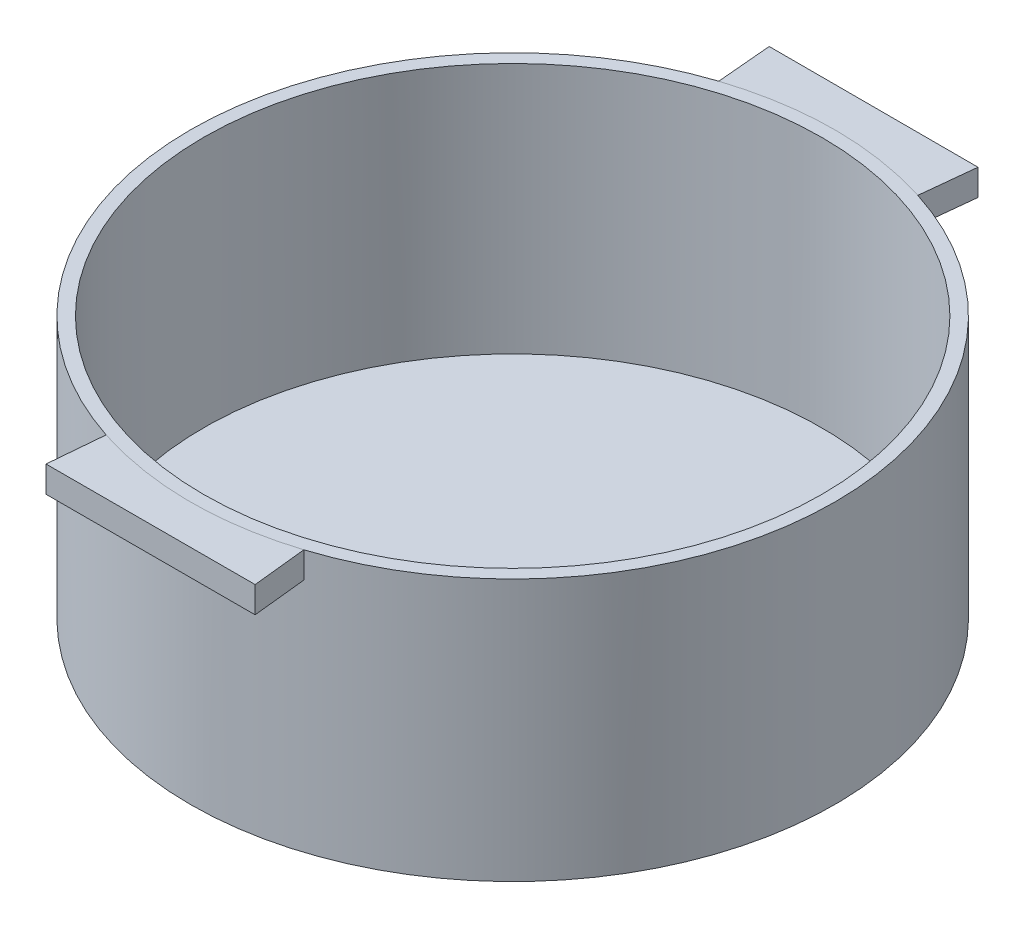
ISO-10303-21;
HEADER;
FILE_DESCRIPTION(('STEP AP214'),'2;1');
FILE_NAME('part.step','',(''),(''),'','','');
FILE_SCHEMA(('AUTOMOTIVE_DESIGN { 1 0 10303 214 1 1 1 1 }'));
ENDSEC;
DATA;
#1=APPLICATION_CONTEXT('core data for automotive mechanical design processes');
#2=APPLICATION_PROTOCOL_DEFINITION('international standard','automotive_design',2000,#1);
#3=PRODUCT_CONTEXT('',#1,'mechanical');
#4=PRODUCT('Part','Part','',(#3));
#5=PRODUCT_RELATED_PRODUCT_CATEGORY('part','',(#4));
#6=PRODUCT_DEFINITION_FORMATION('','',#4);
#7=PRODUCT_DEFINITION_CONTEXT('part definition',#1,'design');
#8=PRODUCT_DEFINITION('design','',#6,#7);
#9=PRODUCT_DEFINITION_SHAPE('','',#8);
#10=(LENGTH_UNIT() NAMED_UNIT(*) SI_UNIT(.MILLI.,.METRE.));
#11=(NAMED_UNIT(*) PLANE_ANGLE_UNIT() SI_UNIT($,.RADIAN.));
#12=(NAMED_UNIT(*) SI_UNIT($,.STERADIAN.) SOLID_ANGLE_UNIT());
#13=UNCERTAINTY_MEASURE_WITH_UNIT(LENGTH_MEASURE(1.E-05),#10,'distance_accuracy_value','');
#14=(GEOMETRIC_REPRESENTATION_CONTEXT(3) GLOBAL_UNCERTAINTY_ASSIGNED_CONTEXT((#13)) GLOBAL_UNIT_ASSIGNED_CONTEXT((#10,
#11,#12)) REPRESENTATION_CONTEXT('',''));
#15=CARTESIAN_POINT('',(0.,0.,0.));
#16=DIRECTION('',(0.,0.,1.));
#17=DIRECTION('',(1.,0.,0.));
#18=AXIS2_PLACEMENT_3D('',#15,#16,#17);
#19=CARTESIAN_POINT('',(0.00483893654175435,-6.7795140591854,0.792868471180382));
#20=DIRECTION('',(0.,1.,0.));
#21=DIRECTION('',(0.,0.,1.));
#22=AXIS2_PLACEMENT_3D('',#19,#20,#21);
#23=CYLINDRICAL_SURFACE('',#22,88.5);
#24=CARTESIAN_POINT('',(0.00483893654175435,65.2204859408146,0.792868471180382));
#25=DIRECTION('',(0.,1.,0.));
#26=DIRECTION('',(0.,0.,1.));
#27=AXIS2_PLACEMENT_3D('',#24,#25,#26);
#28=CIRCLE('',#27,88.5);
#29=CARTESIAN_POINT('',(0.00483893654175435,65.2204859408146,89.2928684711804));
#30=VERTEX_POINT('',#29);
#31=EDGE_CURVE('E290',#30,#30,#28,.T.);
#32=ORIENTED_EDGE('',*,*,#31,.T.);
#33=EDGE_LOOP('',(#32));
#34=FACE_BOUND('',#33,.T.);
#35=DIRECTION('',(0.,-1.,0.));
#36=VECTOR('',#35,1.);
#37=CARTESIAN_POINT('',(13.7811867698871,-7.5295140591854,88.2140457703605));
#38=LINE('',#37,#36);
#39=CARTESIAN_POINT('',(13.7811867698871,-5.2795140591854,88.2140457703605));
#40=VERTEX_POINT('',#39);
#41=CARTESIAN_POINT('',(13.7811867698871,-6.7795140591854,88.2140457703605));
#42=VERTEX_POINT('',#41);
#43=EDGE_CURVE('E391',#40,#42,#38,.T.);
#44=ORIENTED_EDGE('',*,*,#43,.F.);
#45=CARTESIAN_POINT('',(0.00483893654175435,-5.2795140591854,0.792868471180382));
#46=DIRECTION('',(0.,1.,0.));
#47=DIRECTION('',(0.,0.,1.));
#48=AXIS2_PLACEMENT_3D('',#45,#46,#47);
#49=CIRCLE('',#48,88.5);
#50=CARTESIAN_POINT('',(-13.7715088968036,-5.2795140591854,88.2140457703605));
#51=VERTEX_POINT('',#50);
#52=EDGE_CURVE('E298',#40,#51,#49,.F.);
#53=ORIENTED_EDGE('',*,*,#52,.T.);
#54=DIRECTION('',(0.,-1.,0.));
#55=VECTOR('',#54,1.);
#56=CARTESIAN_POINT('',(-13.7715088968036,-7.5295140591854,88.2140457703605));
#57=LINE('',#56,#55);
#58=CARTESIAN_POINT('',(-13.7715088968036,-6.7795140591854,88.2140457703605));
#59=VERTEX_POINT('',#58);
#60=EDGE_CURVE('E386',#59,#51,#57,.F.);
#61=ORIENTED_EDGE('',*,*,#60,.F.);
#62=CARTESIAN_POINT('',(0.00483893654175435,-6.7795140591854,0.792868471180382));
#63=DIRECTION('',(0.,1.,0.));
#64=DIRECTION('',(0.,0.,1.));
#65=AXIS2_PLACEMENT_3D('',#62,#63,#64);
#66=CIRCLE('',#65,88.5);
#67=EDGE_CURVE('E282',#42,#59,#66,.T.);
#68=ORIENTED_EDGE('',*,*,#67,.F.);
#69=EDGE_LOOP('',(#44,#53,#61,#68));
#70=FACE_BOUND('',#69,.T.);
#71=ADVANCED_FACE('F42',(#34,#70),#23,.F.);
#72=CARTESIAN_POINT('',(0.00483893654175435,65.2204859408146,0.792868471180382));
#73=DIRECTION('',(0.,-1.,0.));
#74=DIRECTION('',(0.,0.,-1.));
#75=AXIS2_PLACEMENT_3D('',#72,#73,#74);
#76=CYLINDRICAL_SURFACE('',#75,92.25);
#77=CARTESIAN_POINT('',(0.00483893654175435,57.7204859408146,0.792868471180382));
#78=DIRECTION('',(0.,1.,0.));
#79=DIRECTION('',(0.,0.,1.));
#80=AXIS2_PLACEMENT_3D('',#77,#78,#79);
#81=CIRCLE('',#80,92.25);
#82=CARTESIAN_POINT('',(28.1015082692353,57.7204859408146,-87.0743021468));
#83=VERTEX_POINT('',#82);
#84=CARTESIAN_POINT('',(-28.6746527071315,57.7204859408146,-86.885802019769));
#85=VERTEX_POINT('',#84);
#86=EDGE_CURVE('E11',#83,#85,#81,.T.);
#87=ORIENTED_EDGE('',*,*,#86,.F.);
#88=DIRECTION('',(0.,1.,0.));
#89=VECTOR('',#88,1.);
#90=CARTESIAN_POINT('',(28.1015082692353,57.7204859408146,-87.0743021468));
#91=LINE('',#90,#89);
#92=CARTESIAN_POINT('',(28.1015082692353,65.2204859408146,-87.0743021468));
#93=VERTEX_POINT('',#92);
#94=EDGE_CURVE('E331',#83,#93,#91,.T.);
#95=ORIENTED_EDGE('',*,*,#94,.T.);
#96=CARTESIAN_POINT('',(0.00483893654175435,65.2204859408146,0.792868471180382));
#97=DIRECTION('',(0.,1.,0.));
#98=DIRECTION('',(0.,0.,1.));
#99=AXIS2_PLACEMENT_3D('',#96,#97,#98);
#100=CIRCLE('',#99,92.25);
#101=CARTESIAN_POINT('',(28.1015082692353,65.2204859408146,88.6600390891608));
#102=VERTEX_POINT('',#101);
#103=EDGE_CURVE('E287',#102,#93,#100,.T.);
#104=ORIENTED_EDGE('',*,*,#103,.F.);
#105=DIRECTION('',(0.,1.,0.));
#106=VECTOR('',#105,1.);
#107=CARTESIAN_POINT('',(28.1015082692353,57.7204859408146,88.6600390891608));
#108=LINE('',#107,#106);
#109=CARTESIAN_POINT('',(28.1015082692353,57.7204859408146,88.6600390891608));
#110=VERTEX_POINT('',#109);
#111=EDGE_CURVE('E380',#110,#102,#108,.T.);
#112=ORIENTED_EDGE('',*,*,#111,.F.);
#113=CARTESIAN_POINT('',(0.00483893654175435,57.7204859408146,0.792868471180382));
#114=DIRECTION('',(0.,-1.,0.));
#115=DIRECTION('',(0.,0.,-1.));
#116=AXIS2_PLACEMENT_3D('',#113,#114,#115);
#117=CIRCLE('',#116,92.25);
#118=CARTESIAN_POINT('',(-28.6746527071315,57.7204859408146,88.4715389621298));
#119=VERTEX_POINT('',#118);
#120=EDGE_CURVE('E308',#110,#119,#117,.T.);
#121=ORIENTED_EDGE('',*,*,#120,.T.);
#122=DIRECTION('',(0.,1.,0.));
#123=VECTOR('',#122,1.);
#124=CARTESIAN_POINT('',(-28.6746527071315,57.7204859408146,88.4715389621298));
#125=LINE('',#124,#123);
#126=CARTESIAN_POINT('',(-28.6746527071315,65.2204859408146,88.4715389621298));
#127=VERTEX_POINT('',#126);
#128=EDGE_CURVE('E216',#119,#127,#125,.T.);
#129=ORIENTED_EDGE('',*,*,#128,.T.);
#130=CARTESIAN_POINT('',(-28.6746527071315,65.2204859408146,-86.885802019769));
#131=VERTEX_POINT('',#130);
#132=EDGE_CURVE('E281',#131,#127,#100,.T.);
#133=ORIENTED_EDGE('',*,*,#132,.F.);
#134=DIRECTION('',(0.,1.,0.));
#135=VECTOR('',#134,1.);
#136=CARTESIAN_POINT('',(-28.6746527071315,57.7204859408146,-86.885802019769));
#137=LINE('',#136,#135);
#138=EDGE_CURVE('E61',#85,#131,#137,.T.);
#139=ORIENTED_EDGE('',*,*,#138,.F.);
#140=EDGE_LOOP('',(#87,#95,#104,#112,#121,#129,#133,#139));
#141=FACE_BOUND('',#140,.T.);
#142=CARTESIAN_POINT('',(0.00483893654175435,-9.7795140591854,0.792868471180382));
#143=DIRECTION('',(0.,1.,0.));
#144=DIRECTION('',(0.,0.,1.));
#145=AXIS2_PLACEMENT_3D('',#142,#143,#144);
#146=CIRCLE('',#145,92.25);
#147=CARTESIAN_POINT('',(0.00483893654175435,-9.7795140591854,93.0428684711804));
#148=VERTEX_POINT('',#147);
#149=EDGE_CURVE('E278',#148,#148,#146,.T.);
#150=ORIENTED_EDGE('',*,*,#149,.T.);
#151=EDGE_LOOP('',(#150));
#152=FACE_BOUND('',#151,.T.);
#153=ADVANCED_FACE('F44',(#141,#152),#76,.T.);
#154=CARTESIAN_POINT('',(0.00483893654175435,65.2204859408146,0.792868471180382));
#155=DIRECTION('',(0.,1.,0.));
#156=DIRECTION('',(0.,0.,1.));
#157=AXIS2_PLACEMENT_3D('',#154,#155,#156);
#158=PLANE('',#157);
#159=CARTESIAN_POINT('',(-28.6746527071315,65.2204859408146,-86.885802019769));
#160=CARTESIAN_POINT('',(-0.301330472783207,65.2204859408146,-95.9332188019076));
#161=CARTESIAN_POINT('',(28.1015082692353,65.2204859408146,-87.0743021468));
#162=B_SPLINE_CURVE_WITH_KNOTS('',2,(#159,#160,#161),.UNSPECIFIED.,.F.,.F.,(3,3),(0.,1.),.UNSPECIFIED.);
#163=EDGE_CURVE('E51',#131,#93,#162,.T.);
#164=ORIENTED_EDGE('',*,*,#163,.F.);
#165=ORIENTED_EDGE('',*,*,#132,.T.);
#166=CARTESIAN_POINT('',(28.1015082692353,65.2204859408146,88.6600390891608));
#167=CARTESIAN_POINT('',(-0.301330472783207,65.2204859408146,97.5189557442683));
#168=CARTESIAN_POINT('',(-28.6746527071315,65.2204859408146,88.4715389621298));
#169=B_SPLINE_CURVE_WITH_KNOTS('',2,(#166,#167,#168),.UNSPECIFIED.,.F.,.F.,(3,3),(0.,1.),.UNSPECIFIED.);
#170=EDGE_CURVE('E302',#102,#127,#169,.T.);
#171=ORIENTED_EDGE('',*,*,#170,.F.);
#172=ORIENTED_EDGE('',*,*,#103,.T.);
#173=EDGE_LOOP('',(#164,#165,#171,#172));
#174=FACE_BOUND('',#173,.T.);
#175=ORIENTED_EDGE('',*,*,#31,.F.);
#176=EDGE_LOOP('',(#175));
#177=FACE_BOUND('',#176,.T.);
#178=ADVANCED_FACE('F261',(#174,#177),#158,.T.);
#179=CARTESIAN_POINT('',(0.00483893654175435,-9.7795140591854,0.792868471180382));
#180=DIRECTION('',(0.,1.,0.));
#181=DIRECTION('',(0.,0.,1.));
#182=AXIS2_PLACEMENT_3D('',#179,#180,#181);
#183=PLANE('',#182);
#184=CARTESIAN_POINT('',(0.00483893654175435,-9.7795140591854,59.8862812914137));
#185=DIRECTION('',(0.,1.,0.));
#186=DIRECTION('',(0.,0.,1.));
#187=AXIS2_PLACEMENT_3D('',#184,#185,#186);
#188=CIRCLE('',#187,31.5);
#189=CARTESIAN_POINT('',(0.00483893654175435,-9.7795140591854,91.3862812914137));
#190=VERTEX_POINT('',#189);
#191=EDGE_CURVE('E271',#190,#190,#188,.T.);
#192=ORIENTED_EDGE('',*,*,#191,.T.);
#193=EDGE_LOOP('',(#192));
#194=FACE_BOUND('',#193,.T.);
#195=CARTESIAN_POINT('',(0.00483893654175435,-9.7795140591854,0.792868471180382));
#196=DIRECTION('',(0.,1.,0.));
#197=DIRECTION('',(0.,0.,1.));
#198=AXIS2_PLACEMENT_3D('',#195,#196,#197);
#199=CIRCLE('',#198,9.);
#200=CARTESIAN_POINT('',(0.00483893654175435,-9.7795140591854,9.79286847118038));
#201=VERTEX_POINT('',#200);
#202=EDGE_CURVE('E275',#201,#201,#199,.T.);
#203=ORIENTED_EDGE('',*,*,#202,.T.);
#204=EDGE_LOOP('',(#203));
#205=FACE_BOUND('',#204,.T.);
#206=ORIENTED_EDGE('',*,*,#149,.F.);
#207=EDGE_LOOP('',(#206));
#208=FACE_BOUND('',#207,.T.);
#209=ADVANCED_FACE('F256',(#194,#205,#208),#183,.F.);
#210=CARTESIAN_POINT('',(0.00483893654175435,-6.7795140591854,0.792868471180382));
#211=DIRECTION('',(0.,1.,0.));
#212=DIRECTION('',(0.,0.,1.));
#213=AXIS2_PLACEMENT_3D('',#210,#211,#212);
#214=PLANE('',#213);
#215=CARTESIAN_POINT('',(0.00483893654175435,-6.7795140591854,0.792868471180382));
#216=DIRECTION('',(0.,1.,0.));
#217=DIRECTION('',(0.,0.,1.));
#218=AXIS2_PLACEMENT_3D('',#215,#216,#217);
#219=CIRCLE('',#218,9.);
#220=CARTESIAN_POINT('',(0.00483893654175435,-6.7795140591854,9.79286847118038));
#221=VERTEX_POINT('',#220);
#222=EDGE_CURVE('E394',#221,#221,#219,.T.);
#223=ORIENTED_EDGE('',*,*,#222,.F.);
#224=EDGE_LOOP('',(#223));
#225=FACE_BOUND('',#224,.T.);
#226=ORIENTED_EDGE('',*,*,#67,.T.);
#227=CARTESIAN_POINT('',(0.00483893654175435,-6.7795140591854,59.8862812914137));
#228=DIRECTION('',(0.,1.,0.));
#229=DIRECTION('',(0.,0.,1.));
#230=AXIS2_PLACEMENT_3D('',#227,#228,#229);
#231=CIRCLE('',#230,31.5);
#232=EDGE_CURVE('E294',#59,#42,#231,.F.);
#233=ORIENTED_EDGE('',*,*,#232,.T.);
#234=EDGE_LOOP('',(#226,#233));
#235=FACE_BOUND('',#234,.T.);
#236=ADVANCED_FACE('F252',(#225,#235),#214,.T.);
#237=CARTESIAN_POINT('',(0.00483893654175435,-6.7795140591854,0.792868471180382));
#238=DIRECTION('',(0.,-1.,0.));
#239=DIRECTION('',(0.,0.,-1.));
#240=AXIS2_PLACEMENT_3D('',#237,#238,#239);
#241=CYLINDRICAL_SURFACE('',#240,9.);
#242=ORIENTED_EDGE('',*,*,#222,.T.);
#243=EDGE_LOOP('',(#242));
#244=FACE_BOUND('',#243,.T.);
#245=ORIENTED_EDGE('',*,*,#202,.F.);
#246=EDGE_LOOP('',(#245));
#247=FACE_BOUND('',#246,.T.);
#248=ADVANCED_FACE('F245',(#244,#247),#241,.F.);
#249=CARTESIAN_POINT('',(0.00483893654175435,-5.2795140591854,59.8862812914137));
#250=DIRECTION('',(0.,1.,0.));
#251=DIRECTION('',(0.,0.,1.));
#252=AXIS2_PLACEMENT_3D('',#249,#250,#251);
#253=PLANE('',#252);
#254=CARTESIAN_POINT('',(0.00483893654175435,-5.2795140591854,59.8862812914137));
#255=DIRECTION('',(0.,1.,0.));
#256=DIRECTION('',(0.,0.,1.));
#257=AXIS2_PLACEMENT_3D('',#254,#255,#256);
#258=CIRCLE('',#257,31.5);
#259=EDGE_CURVE('E382',#51,#40,#258,.T.);
#260=ORIENTED_EDGE('',*,*,#259,.F.);
#261=ORIENTED_EDGE('',*,*,#52,.F.);
#262=EDGE_LOOP('',(#260,#261));
#263=FACE_BOUND('',#262,.T.);
#264=ADVANCED_FACE('F242',(#263),#253,.F.);
#265=CARTESIAN_POINT('',(0.00483893654175435,-5.2795140591854,59.8862812914137));
#266=DIRECTION('',(0.,-1.,0.));
#267=DIRECTION('',(0.,0.,-1.));
#268=AXIS2_PLACEMENT_3D('',#265,#266,#267);
#269=CYLINDRICAL_SURFACE('',#268,31.5);
#270=ORIENTED_EDGE('',*,*,#191,.F.);
#271=EDGE_LOOP('',(#270));
#272=FACE_BOUND('',#271,.T.);
#273=ORIENTED_EDGE('',*,*,#43,.T.);
#274=ORIENTED_EDGE('',*,*,#232,.F.);
#275=ORIENTED_EDGE('',*,*,#60,.T.);
#276=ORIENTED_EDGE('',*,*,#259,.T.);
#277=EDGE_LOOP('',(#273,#274,#275,#276));
#278=FACE_BOUND('',#277,.T.);
#279=ADVANCED_FACE('F240',(#272,#278),#269,.F.);
#280=CARTESIAN_POINT('',(-28.6746527071315,57.7204859408146,88.4715389621298));
#281=DIRECTION('',(-0.996136964952352,0.,-0.0878131371465338));
#282=DIRECTION('',(-0.0878131371465339,0.,0.996136964952352));
#283=AXIS2_PLACEMENT_3D('',#280,#281,#282);
#284=PLANE('',#283);
#285=DIRECTION('',(0.,1.,0.));
#286=VECTOR('',#285,1.);
#287=CARTESIAN_POINT('',(-30.0693584621261,57.7204859408146,104.292838632401));
#288=LINE('',#287,#286);
#289=CARTESIAN_POINT('',(-30.0693584621261,57.7204859408146,104.292838632401));
#290=VERTEX_POINT('',#289);
#291=CARTESIAN_POINT('',(-30.0693584621261,65.2206359408146,104.292838632401));
#292=VERTEX_POINT('',#291);
#293=EDGE_CURVE('E211',#290,#292,#288,.T.);
#294=ORIENTED_EDGE('',*,*,#293,.T.);
#295=DIRECTION('',(-0.0878131371465338,0.,0.996136964952352));
#296=VECTOR('',#295,1.);
#297=CARTESIAN_POINT('',(-28.6746527071315,65.2206359408146,88.4715389621298));
#298=LINE('',#297,#296);
#299=CARTESIAN_POINT('',(-28.6746527071315,65.2206359408146,88.4715389621298));
#300=VERTEX_POINT('',#299);
#301=EDGE_CURVE('E178',#300,#292,#298,.T.);
#302=ORIENTED_EDGE('',*,*,#301,.F.);
#303=EDGE_CURVE('E368',#127,#300,#125,.T.);
#304=ORIENTED_EDGE('',*,*,#303,.F.);
#305=ORIENTED_EDGE('',*,*,#128,.F.);
#306=DIRECTION('',(-0.0878131371465338,0.,0.996136964952352));
#307=VECTOR('',#306,1.);
#308=CARTESIAN_POINT('',(-28.6746527071315,57.7204859408146,88.4715389621298));
#309=LINE('',#308,#307);
#310=EDGE_CURVE('E196',#119,#290,#309,.T.);
#311=ORIENTED_EDGE('',*,*,#310,.T.);
#312=EDGE_LOOP('',(#294,#302,#304,#305,#311));
#313=FACE_BOUND('',#312,.T.);
#314=ADVANCED_FACE('F227',(#313),#284,.T.);
#315=CARTESIAN_POINT('',(28.1015082692353,57.7204859408146,88.6600390891608));
#316=CARTESIAN_POINT('',(-0.301330472783207,57.7204859408146,97.5189557442683));
#317=CARTESIAN_POINT('',(-28.6746527071315,57.7204859408146,88.4715389621298));
#318=B_SPLINE_CURVE_WITH_KNOTS('',2,(#315,#316,#317),.UNSPECIFIED.,.F.,.F.,(3,3),(0.,1.),.UNSPECIFIED.);
#319=DIRECTION('',(0.,1.,0.));
#320=VECTOR('',#319,1.);
#321=SURFACE_OF_LINEAR_EXTRUSION('',#318,#320);
#322=CARTESIAN_POINT('',(28.1015082692353,65.2206359408146,88.6600390891608));
#323=VERTEX_POINT('',#322);
#324=EDGE_CURVE('E376',#102,#323,#108,.T.);
#325=ORIENTED_EDGE('',*,*,#324,.F.);
#326=ORIENTED_EDGE('',*,*,#170,.T.);
#327=ORIENTED_EDGE('',*,*,#303,.T.);
#328=CARTESIAN_POINT('',(28.1015082692353,65.2206359408146,88.6600390891608));
#329=CARTESIAN_POINT('',(-0.301330472783207,65.2206359408146,97.5189557442683));
#330=CARTESIAN_POINT('',(-28.6746527071315,65.2206359408146,88.4715389621298));
#331=B_SPLINE_CURVE_WITH_KNOTS('',2,(#328,#329,#330),.UNSPECIFIED.,.F.,.F.,(3,3),(0.,1.),.UNSPECIFIED.);
#332=EDGE_CURVE('E190',#323,#300,#331,.T.);
#333=ORIENTED_EDGE('',*,*,#332,.F.);
#334=EDGE_LOOP('',(#325,#326,#327,#333));
#335=FACE_BOUND('',#334,.T.);
#336=ADVANCED_FACE('F222',(#335),#321,.T.);
#337=CARTESIAN_POINT('',(28.1015082692353,57.7204859408146,88.6600390891608));
#338=DIRECTION('',(0.994493765858174,0.,-0.104795752152587));
#339=DIRECTION('',(-0.104795752152588,0.,-0.994493765858175));
#340=AXIS2_PLACEMENT_3D('',#337,#338,#339);
#341=PLANE('',#340);
#342=ORIENTED_EDGE('',*,*,#111,.T.);
#343=ORIENTED_EDGE('',*,*,#324,.T.);
#344=DIRECTION('',(-0.104795752152588,0.,-0.994493765858174));
#345=VECTOR('',#344,1.);
#346=CARTESIAN_POINT('',(28.1015082692353,65.2206359408146,88.6600390891608));
#347=LINE('',#346,#345);
#348=CARTESIAN_POINT('',(29.7437780548404,65.2206359408146,104.244898495136));
#349=VERTEX_POINT('',#348);
#350=EDGE_CURVE('E186',#349,#323,#347,.T.);
#351=ORIENTED_EDGE('',*,*,#350,.F.);
#352=DIRECTION('',(0.,1.,0.));
#353=VECTOR('',#352,1.);
#354=CARTESIAN_POINT('',(29.7437780548404,57.7204859408146,104.244898495136));
#355=LINE('',#354,#353);
#356=CARTESIAN_POINT('',(29.7437780548404,57.7204859408146,104.244898495136));
#357=VERTEX_POINT('',#356);
#358=EDGE_CURVE('E372',#357,#349,#355,.T.);
#359=ORIENTED_EDGE('',*,*,#358,.F.);
#360=DIRECTION('',(-0.104795752152588,0.,-0.994493765858174));
#361=VECTOR('',#360,1.);
#362=CARTESIAN_POINT('',(28.1015082692353,57.7204859408146,88.6600390891608));
#363=LINE('',#362,#361);
#364=EDGE_CURVE('E207',#357,#110,#363,.T.);
#365=ORIENTED_EDGE('',*,*,#364,.T.);
#366=EDGE_LOOP('',(#342,#343,#351,#359,#365));
#367=FACE_BOUND('',#366,.T.);
#368=ADVANCED_FACE('F226',(#367),#341,.T.);
#369=CARTESIAN_POINT('',(29.7437780548404,57.7204859408146,104.244898495136));
#370=DIRECTION('',(0.000801498210232348,0.,0.999999678800258));
#371=DIRECTION('',(0.999999678800258,0.,-0.000801498210232348));
#372=AXIS2_PLACEMENT_3D('',#369,#370,#371);
#373=PLANE('',#372);
#374=ORIENTED_EDGE('',*,*,#358,.T.);
#375=DIRECTION('',(0.999999678800258,0.,-0.000801498210232348));
#376=VECTOR('',#375,1.);
#377=CARTESIAN_POINT('',(29.7437780548404,65.2206359408146,104.244898495136));
#378=LINE('',#377,#376);
#379=EDGE_CURVE('E182',#292,#349,#378,.T.);
#380=ORIENTED_EDGE('',*,*,#379,.F.);
#381=ORIENTED_EDGE('',*,*,#293,.F.);
#382=DIRECTION('',(0.999999678800258,0.,-0.000801498210232348));
#383=VECTOR('',#382,1.);
#384=CARTESIAN_POINT('',(29.7437780548404,57.7204859408146,104.244898495136));
#385=LINE('',#384,#383);
#386=EDGE_CURVE('E203',#290,#357,#385,.T.);
#387=ORIENTED_EDGE('',*,*,#386,.T.);
#388=EDGE_LOOP('',(#374,#380,#381,#387));
#389=FACE_BOUND('',#388,.T.);
#390=ADVANCED_FACE('F233',(#389),#373,.T.);
#391=CARTESIAN_POINT('',(-0.29395134586564,57.7204859408146,93.0423723849568));
#392=DIRECTION('',(0.,-1.,0.));
#393=DIRECTION('',(0.,0.,-1.));
#394=AXIS2_PLACEMENT_3D('',#391,#392,#393);
#395=PLANE('',#394);
#396=ORIENTED_EDGE('',*,*,#120,.F.);
#397=ORIENTED_EDGE('',*,*,#364,.F.);
#398=ORIENTED_EDGE('',*,*,#386,.F.);
#399=ORIENTED_EDGE('',*,*,#310,.F.);
#400=EDGE_LOOP('',(#396,#397,#398,#399));
#401=FACE_BOUND('',#400,.T.);
#402=ADVANCED_FACE('F229',(#401),#395,.T.);
#403=CARTESIAN_POINT('',(-0.29395134586564,65.2206359408146,93.0423723849568));
#404=DIRECTION('',(0.,-1.,0.));
#405=DIRECTION('',(0.,0.,-1.));
#406=AXIS2_PLACEMENT_3D('',#403,#404,#405);
#407=PLANE('',#406);
#408=ORIENTED_EDGE('',*,*,#301,.T.);
#409=ORIENTED_EDGE('',*,*,#379,.T.);
#410=ORIENTED_EDGE('',*,*,#350,.T.);
#411=ORIENTED_EDGE('',*,*,#332,.T.);
#412=EDGE_LOOP('',(#408,#409,#410,#411));
#413=FACE_BOUND('',#412,.T.);
#414=ADVANCED_FACE('F353',(#413),#407,.F.);
#415=CARTESIAN_POINT('',(28.1015082692353,57.7204859408146,-87.0743021468));
#416=DIRECTION('',(0.994493765858174,0.,0.104795752152587));
#417=DIRECTION('',(0.104795752152588,0.,-0.994493765858175));
#418=AXIS2_PLACEMENT_3D('',#415,#416,#417);
#419=PLANE('',#418);
#420=DIRECTION('',(0.,1.,0.));
#421=VECTOR('',#420,1.);
#422=CARTESIAN_POINT('',(29.7437780548404,57.7204859408146,-102.659161552775));
#423=LINE('',#422,#421);
#424=CARTESIAN_POINT('',(29.7437780548404,57.7204859408146,-102.659161552775));
#425=VERTEX_POINT('',#424);
#426=CARTESIAN_POINT('',(29.7437780548404,65.2206359408146,-102.659161552775));
#427=VERTEX_POINT('',#426);
#428=EDGE_CURVE('E141',#425,#427,#423,.T.);
#429=ORIENTED_EDGE('',*,*,#428,.T.);
#430=DIRECTION('',(0.104795752152588,0.,-0.994493765858174));
#431=VECTOR('',#430,1.);
#432=CARTESIAN_POINT('',(28.1015082692353,65.2206359408146,-87.0743021468));
#433=LINE('',#432,#431);
#434=CARTESIAN_POINT('',(28.1015082692353,65.2206359408146,-87.0743021468));
#435=VERTEX_POINT('',#434);
#436=EDGE_CURVE('E174',#435,#427,#433,.T.);
#437=ORIENTED_EDGE('',*,*,#436,.F.);
#438=EDGE_CURVE('E326',#93,#435,#91,.T.);
#439=ORIENTED_EDGE('',*,*,#438,.F.);
#440=ORIENTED_EDGE('',*,*,#94,.F.);
#441=DIRECTION('',(0.104795752152588,0.,-0.994493765858174));
#442=VECTOR('',#441,1.);
#443=CARTESIAN_POINT('',(28.1015082692353,57.7204859408146,-87.0743021468));
#444=LINE('',#443,#442);
#445=EDGE_CURVE('E153',#83,#425,#444,.T.);
#446=ORIENTED_EDGE('',*,*,#445,.T.);
#447=EDGE_LOOP('',(#429,#437,#439,#440,#446));
#448=FACE_BOUND('',#447,.T.);
#449=ADVANCED_FACE('F330',(#448),#419,.T.);
#450=CARTESIAN_POINT('',(-28.6746527071315,57.7204859408146,-86.885802019769));
#451=CARTESIAN_POINT('',(-0.301330472783207,57.7204859408146,-95.9332188019076));
#452=CARTESIAN_POINT('',(28.1015082692353,57.7204859408146,-87.0743021468));
#453=B_SPLINE_CURVE_WITH_KNOTS('',2,(#450,#451,#452),.UNSPECIFIED.,.F.,.F.,(3,3),(0.,1.),.UNSPECIFIED.);
#454=DIRECTION('',(0.,1.,0.));
#455=VECTOR('',#454,1.);
#456=SURFACE_OF_LINEAR_EXTRUSION('',#453,#455);
#457=CARTESIAN_POINT('',(-28.6746527071315,65.2206359408146,-86.885802019769));
#458=VERTEX_POINT('',#457);
#459=EDGE_CURVE('E327',#131,#458,#137,.T.);
#460=ORIENTED_EDGE('',*,*,#459,.F.);
#461=ORIENTED_EDGE('',*,*,#163,.T.);
#462=ORIENTED_EDGE('',*,*,#438,.T.);
#463=CARTESIAN_POINT('',(-28.6746527071315,65.2206359408146,-86.885802019769));
#464=CARTESIAN_POINT('',(-0.301330472783207,65.2206359408146,-95.9332188019076));
#465=CARTESIAN_POINT('',(28.1015082692353,65.2206359408146,-87.0743021468));
#466=B_SPLINE_CURVE_WITH_KNOTS('',2,(#463,#464,#465),.UNSPECIFIED.,.F.,.F.,(3,3),(0.,1.),.UNSPECIFIED.);
#467=EDGE_CURVE('E157',#458,#435,#466,.T.);
#468=ORIENTED_EDGE('',*,*,#467,.F.);
#469=EDGE_LOOP('',(#460,#461,#462,#468));
#470=FACE_BOUND('',#469,.T.);
#471=ADVANCED_FACE('F324',(#470),#456,.T.);
#472=CARTESIAN_POINT('',(-28.6746527071315,57.7204859408146,-86.885802019769));
#473=DIRECTION('',(-0.996136964952352,0.,0.0878131371465338));
#474=DIRECTION('',(0.0878131371465339,0.,0.996136964952352));
#475=AXIS2_PLACEMENT_3D('',#472,#473,#474);
#476=PLANE('',#475);
#477=ORIENTED_EDGE('',*,*,#138,.T.);
#478=ORIENTED_EDGE('',*,*,#459,.T.);
#479=DIRECTION('',(0.0878131371465338,0.,0.996136964952352));
#480=VECTOR('',#479,1.);
#481=CARTESIAN_POINT('',(-28.6746527071315,65.2206359408146,-86.885802019769));
#482=LINE('',#481,#480);
#483=CARTESIAN_POINT('',(-30.0693584621261,65.2206359408146,-102.70710169004));
#484=VERTEX_POINT('',#483);
#485=EDGE_CURVE('E135',#484,#458,#482,.T.);
#486=ORIENTED_EDGE('',*,*,#485,.F.);
#487=DIRECTION('',(0.,1.,0.));
#488=VECTOR('',#487,1.);
#489=CARTESIAN_POINT('',(-30.0693584621261,57.7204859408146,-102.70710169004));
#490=LINE('',#489,#488);
#491=CARTESIAN_POINT('',(-30.0693584621261,57.7204859408146,-102.70710169004));
#492=VERTEX_POINT('',#491);
#493=EDGE_CURVE('E130',#492,#484,#490,.T.);
#494=ORIENTED_EDGE('',*,*,#493,.F.);
#495=DIRECTION('',(0.0878131371465338,0.,0.996136964952352));
#496=VECTOR('',#495,1.);
#497=CARTESIAN_POINT('',(-28.6746527071315,57.7204859408146,-86.885802019769));
#498=LINE('',#497,#496);
#499=EDGE_CURVE('E133',#492,#85,#498,.T.);
#500=ORIENTED_EDGE('',*,*,#499,.T.);
#501=EDGE_LOOP('',(#477,#478,#486,#494,#500));
#502=FACE_BOUND('',#501,.T.);
#503=ADVANCED_FACE('F132',(#502),#476,.T.);
#504=CARTESIAN_POINT('',(29.7437780548404,57.7204859408146,-102.659161552775));
#505=DIRECTION('',(0.000801498210232348,0.,-0.999999678800258));
#506=DIRECTION('',(-0.999999678800258,0.,-0.000801498210232348));
#507=AXIS2_PLACEMENT_3D('',#504,#505,#506);
#508=PLANE('',#507);
#509=ORIENTED_EDGE('',*,*,#493,.T.);
#510=DIRECTION('',(-0.999999678800258,0.,-0.000801498210232348));
#511=VECTOR('',#510,1.);
#512=CARTESIAN_POINT('',(29.7437780548404,65.2206359408146,-102.659161552775));
#513=LINE('',#512,#511);
#514=EDGE_CURVE('E171',#427,#484,#513,.T.);
#515=ORIENTED_EDGE('',*,*,#514,.F.);
#516=ORIENTED_EDGE('',*,*,#428,.F.);
#517=DIRECTION('',(-0.999999678800258,0.,-0.000801498210232348));
#518=VECTOR('',#517,1.);
#519=CARTESIAN_POINT('',(29.7437780548404,57.7204859408146,-102.659161552775));
#520=LINE('',#519,#518);
#521=EDGE_CURVE('E147',#425,#492,#520,.T.);
#522=ORIENTED_EDGE('',*,*,#521,.T.);
#523=EDGE_LOOP('',(#509,#515,#516,#522));
#524=FACE_BOUND('',#523,.T.);
#525=ADVANCED_FACE('F151',(#524),#508,.T.);
#526=CARTESIAN_POINT('',(-0.29395134586564,57.7204859408146,-91.456635442596));
#527=DIRECTION('',(0.,1.,0.));
#528=DIRECTION('',(0.,0.,1.));
#529=AXIS2_PLACEMENT_3D('',#526,#527,#528);
#530=PLANE('',#529);
#531=ORIENTED_EDGE('',*,*,#445,.F.);
#532=ORIENTED_EDGE('',*,*,#86,.T.);
#533=ORIENTED_EDGE('',*,*,#499,.F.);
#534=ORIENTED_EDGE('',*,*,#521,.F.);
#535=EDGE_LOOP('',(#531,#532,#533,#534));
#536=FACE_BOUND('',#535,.T.);
#537=ADVANCED_FACE('F146',(#536),#530,.F.);
#538=CARTESIAN_POINT('',(-0.29395134586564,65.2206359408146,-91.456635442596));
#539=DIRECTION('',(0.,1.,0.));
#540=DIRECTION('',(0.,0.,1.));
#541=AXIS2_PLACEMENT_3D('',#538,#539,#540);
#542=PLANE('',#541);
#543=ORIENTED_EDGE('',*,*,#436,.T.);
#544=ORIENTED_EDGE('',*,*,#514,.T.);
#545=ORIENTED_EDGE('',*,*,#485,.T.);
#546=ORIENTED_EDGE('',*,*,#467,.T.);
#547=EDGE_LOOP('',(#543,#544,#545,#546));
#548=FACE_BOUND('',#547,.T.);
#549=ADVANCED_FACE('F350',(#548),#542,.T.);
#550=CLOSED_SHELL('',(#71,#153,#178,#209,#236,#248,#264,#279,#314,#336,#368,#390,#402,#414,#449,
#471,#503,#525,#537,#549));
#551=MANIFOLD_SOLID_BREP('B2',#550);
#552=ADVANCED_BREP_SHAPE_REPRESENTATION('',(#18,#551),#14);
#553=SHAPE_DEFINITION_REPRESENTATION(#9,#552);
ENDSEC;
END-ISO-10303-21;
